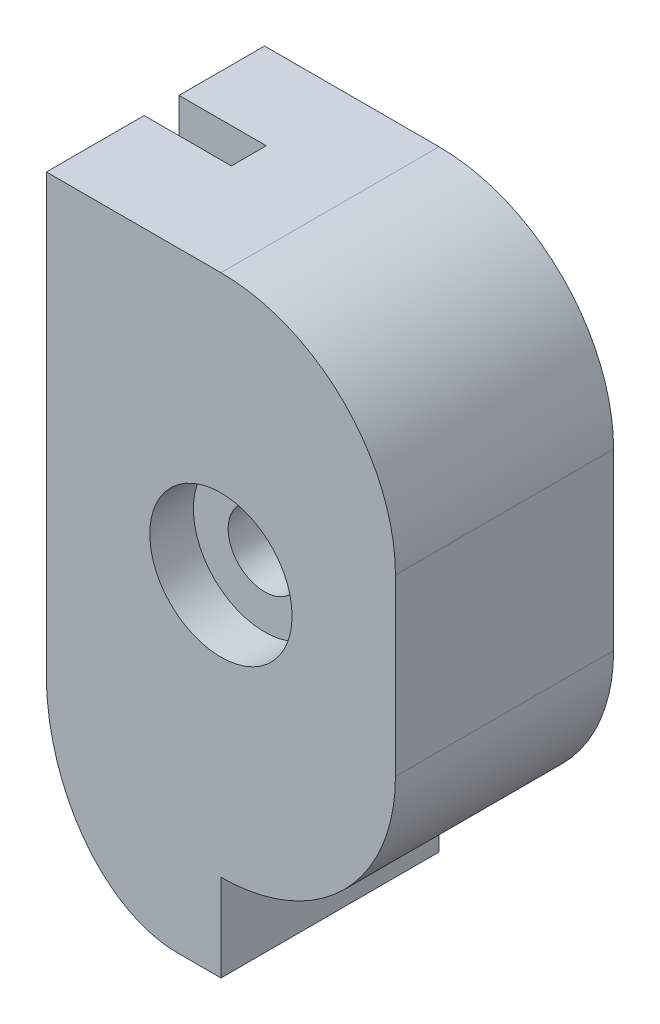
ISO-10303-21;
HEADER;
FILE_DESCRIPTION(('STEP AP214'),'2;1');
FILE_NAME('part.step','',(''),(''),'','','');
FILE_SCHEMA(('AUTOMOTIVE_DESIGN { 1 0 10303 214 1 1 1 1 }'));
ENDSEC;
DATA;
#1=APPLICATION_CONTEXT('core data for automotive mechanical design processes');
#2=APPLICATION_PROTOCOL_DEFINITION('international standard','automotive_design',2000,#1);
#3=PRODUCT_CONTEXT('',#1,'mechanical');
#4=PRODUCT('Part','Part','',(#3));
#5=PRODUCT_RELATED_PRODUCT_CATEGORY('part','',(#4));
#6=PRODUCT_DEFINITION_FORMATION('','',#4);
#7=PRODUCT_DEFINITION_CONTEXT('part definition',#1,'design');
#8=PRODUCT_DEFINITION('design','',#6,#7);
#9=PRODUCT_DEFINITION_SHAPE('','',#8);
#10=(LENGTH_UNIT() NAMED_UNIT(*) SI_UNIT(.MILLI.,.METRE.));
#11=(NAMED_UNIT(*) PLANE_ANGLE_UNIT() SI_UNIT($,.RADIAN.));
#12=(NAMED_UNIT(*) SI_UNIT($,.STERADIAN.) SOLID_ANGLE_UNIT());
#13=UNCERTAINTY_MEASURE_WITH_UNIT(LENGTH_MEASURE(1.E-05),#10,'distance_accuracy_value','');
#14=(GEOMETRIC_REPRESENTATION_CONTEXT(3) GLOBAL_UNCERTAINTY_ASSIGNED_CONTEXT((#13)) GLOBAL_UNIT_ASSIGNED_CONTEXT((#10,
#11,#12)) REPRESENTATION_CONTEXT('',''));
#15=CARTESIAN_POINT('',(0.,0.,0.));
#16=DIRECTION('',(0.,0.,1.));
#17=DIRECTION('',(1.,0.,0.));
#18=AXIS2_PLACEMENT_3D('',#15,#16,#17);
#19=CARTESIAN_POINT('',(-20.,30.,12.5));
#20=DIRECTION('',(1.,0.,0.));
#21=DIRECTION('',(0.,1.,0.));
#22=AXIS2_PLACEMENT_3D('',#19,#20,#21);
#23=PLANE('',#22);
#24=DIRECTION('',(0.,-1.,0.));
#25=VECTOR('',#24,1.);
#26=CARTESIAN_POINT('',(-20.,30.,-12.5));
#27=LINE('',#26,#25);
#28=CARTESIAN_POINT('',(-20.,1.77940468532406,-12.5));
#29=VERTEX_POINT('',#28);
#30=CARTESIAN_POINT('',(-20.,-20.,-12.5));
#31=VERTEX_POINT('',#30);
#32=EDGE_CURVE('E208',#29,#31,#27,.T.);
#33=ORIENTED_EDGE('',*,*,#32,.T.);
#34=CARTESIAN_POINT('',(-20.,-20.,13.75));
#35=CARTESIAN_POINT('',(-20.,-20.,4.58333333333333));
#36=CARTESIAN_POINT('',(-20.,-20.,-4.58333333333333));
#37=CARTESIAN_POINT('',(-20.,-20.,-13.75));
#38=(BOUNDED_CURVE() B_SPLINE_CURVE(3,(#34,#35,#36,#37),.UNSPECIFIED.,.F.,
.F.) B_SPLINE_CURVE_WITH_KNOTS((4,4),(-0.01375,0.01375),
.UNSPECIFIED.) CURVE() GEOMETRIC_REPRESENTATION_ITEM() RATIONAL_B_SPLINE_CURVE((1.,1.,1.,1.)) REPRESENTATION_ITEM(''));
#39=CARTESIAN_POINT('',(-20.,-20.,-2.69593991600876));
#40=VERTEX_POINT('',#39);
#41=EDGE_CURVE('E376',#31,#40,#38,.F.);
#42=ORIENTED_EDGE('',*,*,#41,.T.);
#43=DIRECTION('',(0.,-1.,0.));
#44=VECTOR('',#43,1.);
#45=CARTESIAN_POINT('',(-20.,30.,-2.69593991600876));
#46=LINE('',#45,#44);
#47=CARTESIAN_POINT('',(-20.,30.,-2.69593991600876));
#48=VERTEX_POINT('',#47);
#49=EDGE_CURVE('E324',#48,#40,#46,.T.);
#50=ORIENTED_EDGE('',*,*,#49,.F.);
#51=DIRECTION('',(0.,0.,-1.));
#52=VECTOR('',#51,1.);
#53=CARTESIAN_POINT('',(-20.,30.,12.5));
#54=LINE('',#53,#52);
#55=CARTESIAN_POINT('',(-20.,30.,-12.5));
#56=VERTEX_POINT('',#55);
#57=EDGE_CURVE('E336',#48,#56,#54,.T.);
#58=ORIENTED_EDGE('',*,*,#57,.T.);
#59=CARTESIAN_POINT('',(-20.,3.18411934499227,-12.5));
#60=VERTEX_POINT('',#59);
#61=EDGE_CURVE('E337',#56,#60,#27,.T.);
#62=ORIENTED_EDGE('',*,*,#61,.T.);
#63=DIRECTION('',(0.,0.,-1.));
#64=VECTOR('',#63,1.);
#65=CARTESIAN_POINT('',(-20.,3.18411934499227,-8.5));
#66=LINE('',#65,#64);
#67=CARTESIAN_POINT('',(-20.,3.18411934499227,-8.5));
#68=VERTEX_POINT('',#67);
#69=EDGE_CURVE('E386',#68,#60,#66,.T.);
#70=ORIENTED_EDGE('',*,*,#69,.F.);
#71=DIRECTION('',(0.,-1.,0.));
#72=VECTOR('',#71,1.);
#73=CARTESIAN_POINT('',(-20.,3.18411934499227,-8.5));
#74=LINE('',#73,#72);
#75=CARTESIAN_POINT('',(-20.,1.77940468532406,-8.5));
#76=VERTEX_POINT('',#75);
#77=EDGE_CURVE('E713',#68,#76,#74,.T.);
#78=ORIENTED_EDGE('',*,*,#77,.T.);
#79=DIRECTION('',(0.,0.,-1.));
#80=VECTOR('',#79,1.);
#81=CARTESIAN_POINT('',(-20.,1.77940468532406,-8.5));
#82=LINE('',#81,#80);
#83=EDGE_CURVE('E701',#76,#29,#82,.T.);
#84=ORIENTED_EDGE('',*,*,#83,.T.);
#85=EDGE_LOOP('',(#33,#42,#50,#58,#62,#70,#78,#84));
#86=FACE_BOUND('',#85,.T.);
#87=ADVANCED_FACE('F40',(#86),#23,.F.);
#88=CARTESIAN_POINT('',(0.,0.,-12.5));
#89=DIRECTION('',(0.,0.,1.));
#90=DIRECTION('',(1.,0.,0.));
#91=AXIS2_PLACEMENT_3D('',#88,#89,#90);
#92=PLANE('',#91);
#93=DIRECTION('',(1.,0.,0.));
#94=VECTOR('',#93,1.);
#95=CARTESIAN_POINT('',(-20.,-40.,-12.5));
#96=LINE('',#95,#94);
#97=CARTESIAN_POINT('',(-4.99999999999999,-40.,-12.5));
#98=VERTEX_POINT('',#97);
#99=CARTESIAN_POINT('',(0.,-40.,-12.5));
#100=VERTEX_POINT('',#99);
#101=EDGE_CURVE('E169',#98,#100,#96,.T.);
#102=ORIENTED_EDGE('',*,*,#101,.F.);
#103=CARTESIAN_POINT('',(-20.,-20.,-12.5));
#104=CARTESIAN_POINT('',(-20.,-40.,-12.5));
#105=CARTESIAN_POINT('',(-4.99999999999999,-40.,-12.5));
#106=(BOUNDED_CURVE() B_SPLINE_CURVE(2,(#103,#104,#105),.UNSPECIFIED.,.F.,
.F.) B_SPLINE_CURVE_WITH_KNOTS((3,3),(0.,1.),
.UNSPECIFIED.) CURVE() GEOMETRIC_REPRESENTATION_ITEM() RATIONAL_B_SPLINE_CURVE((1.,
0.707106781186548,1.)) REPRESENTATION_ITEM(''));
#107=EDGE_CURVE('E373',#98,#31,#106,.F.);
#108=ORIENTED_EDGE('',*,*,#107,.T.);
#109=ORIENTED_EDGE('',*,*,#32,.F.);
#110=DIRECTION('',(0.939692620785908,-0.342020143325669,0.));
#111=VECTOR('',#110,1.);
#112=CARTESIAN_POINT('',(0.,-5.5,-12.5));
#113=LINE('',#112,#111);
#114=CARTESIAN_POINT('',(-7.69838959174189,-2.69801533682121,-12.5));
#115=VERTEX_POINT('',#114);
#116=EDGE_CURVE('E687',#29,#115,#113,.T.);
#117=ORIENTED_EDGE('',*,*,#116,.T.);
#118=CARTESIAN_POINT('',(0.,0.,-12.5));
#119=DIRECTION('',(0.,0.,1.));
#120=DIRECTION('',(1.,0.,0.));
#121=AXIS2_PLACEMENT_3D('',#118,#119,#120);
#122=CIRCLE('',#121,8.15748055860155);
#123=CARTESIAN_POINT('',(-8.07513105136094,-1.15617799983766,-12.5));
#124=VERTEX_POINT('',#123);
#125=EDGE_CURVE('E330',#115,#124,#122,.T.);
#126=ORIENTED_EDGE('',*,*,#125,.T.);
#127=DIRECTION('',(-0.939692620785908,0.342020143325669,0.));
#128=VECTOR('',#127,1.);
#129=CARTESIAN_POINT('',(0.,-4.09528534033179,-12.5));
#130=LINE('',#129,#128);
#131=EDGE_CURVE('E188',#124,#60,#130,.T.);
#132=ORIENTED_EDGE('',*,*,#131,.T.);
#133=ORIENTED_EDGE('',*,*,#61,.F.);
#134=DIRECTION('',(1.,0.,0.));
#135=VECTOR('',#134,1.);
#136=CARTESIAN_POINT('',(-20.,30.,-12.5));
#137=LINE('',#136,#135);
#138=CARTESIAN_POINT('',(0.,30.,-12.5));
#139=VERTEX_POINT('',#138);
#140=EDGE_CURVE('E323',#56,#139,#137,.T.);
#141=ORIENTED_EDGE('',*,*,#140,.T.);
#142=CARTESIAN_POINT('',(0.,10.,-12.5));
#143=DIRECTION('',(0.,0.,1.));
#144=DIRECTION('',(1.,0.,0.));
#145=AXIS2_PLACEMENT_3D('',#142,#143,#144);
#146=CIRCLE('',#145,20.);
#147=CARTESIAN_POINT('',(20.,10.,-12.5));
#148=VERTEX_POINT('',#147);
#149=EDGE_CURVE('E360',#139,#148,#146,.F.);
#150=ORIENTED_EDGE('',*,*,#149,.T.);
#151=DIRECTION('',(0.,-1.,0.));
#152=VECTOR('',#151,1.);
#153=CARTESIAN_POINT('',(20.,30.,-12.5));
#154=LINE('',#153,#152);
#155=CARTESIAN_POINT('',(20.,-9.99999999999999,-12.5));
#156=VERTEX_POINT('',#155);
#157=EDGE_CURVE('E341',#148,#156,#154,.T.);
#158=ORIENTED_EDGE('',*,*,#157,.T.);
#159=CARTESIAN_POINT('',(0.,-10.,-12.5));
#160=DIRECTION('',(0.,0.,1.));
#161=DIRECTION('',(1.,0.,0.));
#162=AXIS2_PLACEMENT_3D('',#159,#160,#161);
#163=CIRCLE('',#162,20.);
#164=CARTESIAN_POINT('',(0.,-30.,-12.5));
#165=VERTEX_POINT('',#164);
#166=EDGE_CURVE('E184',#156,#165,#163,.F.);
#167=ORIENTED_EDGE('',*,*,#166,.T.);
#168=DIRECTION('',(0.,1.,0.));
#169=VECTOR('',#168,1.);
#170=CARTESIAN_POINT('',(0.,-40.,-12.5));
#171=LINE('',#170,#169);
#172=EDGE_CURVE('E181',#100,#165,#171,.T.);
#173=ORIENTED_EDGE('',*,*,#172,.F.);
#174=EDGE_LOOP('',(#102,#108,#109,#117,#126,#132,#133,#141,#150,#158,#167,#173));
#175=FACE_BOUND('',#174,.T.);
#176=ADVANCED_FACE('F182',(#175),#92,.F.);
#177=CARTESIAN_POINT('',(0.,0.,19.1694168368741));
#178=DIRECTION('',(0.,0.,1.));
#179=DIRECTION('',(1.,0.,0.));
#180=AXIS2_PLACEMENT_3D('',#177,#178,#179);
#181=CYLINDRICAL_SURFACE('',#180,8.15748055860155);
#182=CARTESIAN_POINT('',(0.,0.,-7.5));
#183=DIRECTION('',(0.,0.,1.));
#184=DIRECTION('',(1.,0.,0.));
#185=AXIS2_PLACEMENT_3D('',#182,#183,#184);
#186=CIRCLE('',#185,8.15748055860155);
#187=CARTESIAN_POINT('',(8.15748055860155,0.,-7.5));
#188=VERTEX_POINT('',#187);
#189=EDGE_CURVE('E668',#188,#188,#186,.T.);
#190=ORIENTED_EDGE('',*,*,#189,.T.);
#191=EDGE_LOOP('',(#190));
#192=FACE_BOUND('',#191,.T.);
#193=DIRECTION('',(0.,0.,1.));
#194=VECTOR('',#193,1.);
#195=CARTESIAN_POINT('',(-8.07513105136094,-1.15617799983766,19.1694168368741));
#196=LINE('',#195,#194);
#197=CARTESIAN_POINT('',(-8.07513105136094,-1.15617799983766,-8.5));
#198=VERTEX_POINT('',#197);
#199=EDGE_CURVE('E352',#124,#198,#196,.T.);
#200=ORIENTED_EDGE('',*,*,#199,.F.);
#201=ORIENTED_EDGE('',*,*,#125,.F.);
#202=DIRECTION('',(0.,0.,1.));
#203=VECTOR('',#202,1.);
#204=CARTESIAN_POINT('',(-7.69838959174189,-2.69801533682121,19.1694168368741));
#205=LINE('',#204,#203);
#206=CARTESIAN_POINT('',(-7.69838959174189,-2.69801533682121,-8.5));
#207=VERTEX_POINT('',#206);
#208=EDGE_CURVE('E350',#207,#115,#205,.F.);
#209=ORIENTED_EDGE('',*,*,#208,.F.);
#210=CARTESIAN_POINT('',(0.,0.,-8.5));
#211=DIRECTION('',(0.,0.,-1.));
#212=DIRECTION('',(-1.,0.,0.));
#213=AXIS2_PLACEMENT_3D('',#210,#211,#212);
#214=CIRCLE('',#213,8.15748055860155);
#215=EDGE_CURVE('E348',#198,#207,#214,.F.);
#216=ORIENTED_EDGE('',*,*,#215,.F.);
#217=EDGE_LOOP('',(#200,#201,#209,#216));
#218=FACE_BOUND('',#217,.T.);
#219=ADVANCED_FACE('F301',(#192,#218),#181,.F.);
#220=DIRECTION('',(0.,1.,0.));
#221=VECTOR('',#220,1.);
#222=CARTESIAN_POINT('',(-20.,30.,1.30406008399123));
#223=LINE('',#222,#221);
#224=CARTESIAN_POINT('',(-20.,-20.,1.30406008399124));
#225=VERTEX_POINT('',#224);
#226=CARTESIAN_POINT('',(-20.,30.,1.30406008399123));
#227=VERTEX_POINT('',#226);
#228=EDGE_CURVE('E385',#225,#227,#223,.T.);
#229=ORIENTED_EDGE('',*,*,#228,.F.);
#230=CARTESIAN_POINT('',(-20.,-20.,13.75));
#231=CARTESIAN_POINT('',(-20.,-20.,4.58333333333333));
#232=CARTESIAN_POINT('',(-20.,-20.,-4.58333333333333));
#233=CARTESIAN_POINT('',(-20.,-20.,-13.75));
#234=(BOUNDED_CURVE() B_SPLINE_CURVE(3,(#230,#231,#232,#233),.UNSPECIFIED.,.F.,
.F.) B_SPLINE_CURVE_WITH_KNOTS((4,4),(-0.01375,0.01375),
.UNSPECIFIED.) CURVE() GEOMETRIC_REPRESENTATION_ITEM() RATIONAL_B_SPLINE_CURVE((1.,1.,1.,1.)) REPRESENTATION_ITEM(''));
#235=CARTESIAN_POINT('',(-20.,-20.,12.5));
#236=VERTEX_POINT('',#235);
#237=EDGE_CURVE('E317',#225,#236,#234,.F.);
#238=ORIENTED_EDGE('',*,*,#237,.T.);
#239=DIRECTION('',(0.,-1.,0.));
#240=VECTOR('',#239,1.);
#241=CARTESIAN_POINT('',(-20.,30.,12.5));
#242=LINE('',#241,#240);
#243=CARTESIAN_POINT('',(-20.,30.,12.5));
#244=VERTEX_POINT('',#243);
#245=EDGE_CURVE('E319',#244,#236,#242,.T.);
#246=ORIENTED_EDGE('',*,*,#245,.F.);
#247=EDGE_CURVE('E345',#244,#227,#54,.T.);
#248=ORIENTED_EDGE('',*,*,#247,.T.);
#249=EDGE_LOOP('',(#229,#238,#246,#248));
#250=FACE_BOUND('',#249,.T.);
#251=ADVANCED_FACE('F290',(#250),#23,.F.);
#252=CARTESIAN_POINT('',(20.,30.,12.5));
#253=DIRECTION('',(1.,0.,0.));
#254=DIRECTION('',(0.,1.,0.));
#255=AXIS2_PLACEMENT_3D('',#252,#253,#254);
#256=PLANE('',#255);
#257=DIRECTION('',(0.,-1.,0.));
#258=VECTOR('',#257,1.);
#259=CARTESIAN_POINT('',(20.,30.,12.5));
#260=LINE('',#259,#258);
#261=CARTESIAN_POINT('',(20.,10.,12.5));
#262=VERTEX_POINT('',#261);
#263=CARTESIAN_POINT('',(20.,-9.99999999999999,12.5));
#264=VERTEX_POINT('',#263);
#265=EDGE_CURVE('E322',#262,#264,#260,.T.);
#266=ORIENTED_EDGE('',*,*,#265,.T.);
#267=DIRECTION('',(0.,0.,-1.));
#268=VECTOR('',#267,1.);
#269=CARTESIAN_POINT('',(20.,-9.99999999999999,-12.5));
#270=LINE('',#269,#268);
#271=EDGE_CURVE('E357',#264,#156,#270,.T.);
#272=ORIENTED_EDGE('',*,*,#271,.T.);
#273=ORIENTED_EDGE('',*,*,#157,.F.);
#274=DIRECTION('',(0.,0.,-1.));
#275=VECTOR('',#274,1.);
#276=CARTESIAN_POINT('',(20.,10.,12.5));
#277=LINE('',#276,#275);
#278=EDGE_CURVE('E355',#148,#262,#277,.F.);
#279=ORIENTED_EDGE('',*,*,#278,.T.);
#280=EDGE_LOOP('',(#266,#272,#273,#279));
#281=FACE_BOUND('',#280,.T.);
#282=ADVANCED_FACE('F300',(#281),#256,.T.);
#283=CARTESIAN_POINT('',(-20.,30.,12.5));
#284=DIRECTION('',(0.,1.,0.));
#285=DIRECTION('',(0.,0.,1.));
#286=AXIS2_PLACEMENT_3D('',#283,#284,#285);
#287=PLANE('',#286);
#288=DIRECTION('',(1.,0.,0.));
#289=VECTOR('',#288,1.);
#290=CARTESIAN_POINT('',(-20.,30.,12.5));
#291=LINE('',#290,#289);
#292=CARTESIAN_POINT('',(0.,30.,12.5));
#293=VERTEX_POINT('',#292);
#294=EDGE_CURVE('E334',#244,#293,#291,.T.);
#295=ORIENTED_EDGE('',*,*,#294,.T.);
#296=DIRECTION('',(0.,0.,-1.));
#297=VECTOR('',#296,1.);
#298=CARTESIAN_POINT('',(0.,30.,12.5));
#299=LINE('',#298,#297);
#300=EDGE_CURVE('E368',#293,#139,#299,.T.);
#301=ORIENTED_EDGE('',*,*,#300,.T.);
#302=ORIENTED_EDGE('',*,*,#140,.F.);
#303=ORIENTED_EDGE('',*,*,#57,.F.);
#304=DIRECTION('',(-1.,0.,0.));
#305=VECTOR('',#304,1.);
#306=CARTESIAN_POINT('',(-10.,30.,-2.69593991600876));
#307=LINE('',#306,#305);
#308=CARTESIAN_POINT('',(-10.,30.,-2.69593991600876));
#309=VERTEX_POINT('',#308);
#310=EDGE_CURVE('E384',#309,#48,#307,.T.);
#311=ORIENTED_EDGE('',*,*,#310,.F.);
#312=DIRECTION('',(0.,0.,-1.));
#313=VECTOR('',#312,1.);
#314=CARTESIAN_POINT('',(-10.,30.,-2.69593991600876));
#315=LINE('',#314,#313);
#316=CARTESIAN_POINT('',(-10.,30.,1.30406008399124));
#317=VERTEX_POINT('',#316);
#318=EDGE_CURVE('E284',#317,#309,#315,.T.);
#319=ORIENTED_EDGE('',*,*,#318,.F.);
#320=DIRECTION('',(-1.,0.,0.));
#321=VECTOR('',#320,1.);
#322=CARTESIAN_POINT('',(-10.,30.,1.30406008399123));
#323=LINE('',#322,#321);
#324=EDGE_CURVE('E273',#317,#227,#323,.T.);
#325=ORIENTED_EDGE('',*,*,#324,.T.);
#326=ORIENTED_EDGE('',*,*,#247,.F.);
#327=EDGE_LOOP('',(#295,#301,#302,#303,#311,#319,#325,#326));
#328=FACE_BOUND('',#327,.T.);
#329=ADVANCED_FACE('F465',(#328),#287,.T.);
#330=CARTESIAN_POINT('',(0.,0.,12.5));
#331=DIRECTION('',(0.,0.,1.));
#332=DIRECTION('',(1.,0.,0.));
#333=AXIS2_PLACEMENT_3D('',#330,#331,#332);
#334=PLANE('',#333);
#335=CARTESIAN_POINT('',(0.,0.,12.5));
#336=DIRECTION('',(0.,0.,1.));
#337=DIRECTION('',(1.,0.,0.));
#338=AXIS2_PLACEMENT_3D('',#335,#336,#337);
#339=CIRCLE('',#338,8.15748055860155);
#340=CARTESIAN_POINT('',(8.15748055860155,0.,12.5));
#341=VERTEX_POINT('',#340);
#342=EDGE_CURVE('E281',#341,#341,#339,.T.);
#343=ORIENTED_EDGE('',*,*,#342,.F.);
#344=EDGE_LOOP('',(#343));
#345=FACE_BOUND('',#344,.T.);
#346=ORIENTED_EDGE('',*,*,#245,.T.);
#347=CARTESIAN_POINT('',(-4.99999999999999,-40.,12.5));
#348=CARTESIAN_POINT('',(-20.,-40.,12.5));
#349=CARTESIAN_POINT('',(-20.,-20.,12.5));
#350=(BOUNDED_CURVE() B_SPLINE_CURVE(2,(#347,#348,#349),.UNSPECIFIED.,.F.,
.F.) B_SPLINE_CURVE_WITH_KNOTS((3,3),(0.,1.),
.UNSPECIFIED.) CURVE() GEOMETRIC_REPRESENTATION_ITEM() RATIONAL_B_SPLINE_CURVE((1.,
0.707106781186548,1.)) REPRESENTATION_ITEM(''));
#351=CARTESIAN_POINT('',(-4.99999999999999,-40.,12.5));
#352=VERTEX_POINT('',#351);
#353=EDGE_CURVE('E12',#236,#352,#350,.F.);
#354=ORIENTED_EDGE('',*,*,#353,.T.);
#355=DIRECTION('',(1.,0.,0.));
#356=VECTOR('',#355,1.);
#357=CARTESIAN_POINT('',(-20.,-40.,12.5));
#358=LINE('',#357,#356);
#359=CARTESIAN_POINT('',(0.,-40.,12.5));
#360=VERTEX_POINT('',#359);
#361=EDGE_CURVE('E194',#352,#360,#358,.T.);
#362=ORIENTED_EDGE('',*,*,#361,.T.);
#363=DIRECTION('',(0.,1.,0.));
#364=VECTOR('',#363,1.);
#365=CARTESIAN_POINT('',(0.,-40.,12.5));
#366=LINE('',#365,#364);
#367=CARTESIAN_POINT('',(0.,-30.,12.5));
#368=VERTEX_POINT('',#367);
#369=EDGE_CURVE('E189',#360,#368,#366,.T.);
#370=ORIENTED_EDGE('',*,*,#369,.T.);
#371=CARTESIAN_POINT('',(0.,-10.,12.5));
#372=DIRECTION('',(0.,0.,1.));
#373=DIRECTION('',(1.,0.,0.));
#374=AXIS2_PLACEMENT_3D('',#371,#372,#373);
#375=CIRCLE('',#374,20.);
#376=EDGE_CURVE('E367',#368,#264,#375,.T.);
#377=ORIENTED_EDGE('',*,*,#376,.T.);
#378=ORIENTED_EDGE('',*,*,#265,.F.);
#379=CARTESIAN_POINT('',(0.,10.,12.5));
#380=DIRECTION('',(0.,0.,1.));
#381=DIRECTION('',(1.,0.,0.));
#382=AXIS2_PLACEMENT_3D('',#379,#380,#381);
#383=CIRCLE('',#382,20.);
#384=EDGE_CURVE('E365',#262,#293,#383,.T.);
#385=ORIENTED_EDGE('',*,*,#384,.T.);
#386=ORIENTED_EDGE('',*,*,#294,.F.);
#387=EDGE_LOOP('',(#346,#354,#362,#370,#377,#378,#385,#386));
#388=FACE_BOUND('',#387,.T.);
#389=ADVANCED_FACE('F454',(#345,#388),#334,.T.);
#390=CARTESIAN_POINT('',(0.,-4.16978401932688,-7.5));
#391=DIRECTION('',(0.,0.,1.));
#392=DIRECTION('',(1.,0.,0.));
#393=AXIS2_PLACEMENT_3D('',#390,#391,#392);
#394=PLANE('',#393);
#395=ORIENTED_EDGE('',*,*,#189,.F.);
#396=EDGE_LOOP('',(#395));
#397=FACE_BOUND('',#396,.T.);
#398=CARTESIAN_POINT('',(0.,0.,-7.5));
#399=DIRECTION('',(0.,0.,1.));
#400=DIRECTION('',(1.,0.,0.));
#401=AXIS2_PLACEMENT_3D('',#398,#399,#400);
#402=CIRCLE('',#401,4.16978401932688);
#403=CARTESIAN_POINT('',(4.16978401932688,0.,-7.5));
#404=VERTEX_POINT('',#403);
#405=EDGE_CURVE('E671',#404,#404,#402,.T.);
#406=ORIENTED_EDGE('',*,*,#405,.T.);
#407=EDGE_LOOP('',(#406));
#408=FACE_BOUND('',#407,.T.);
#409=ADVANCED_FACE('F464',(#397,#408),#394,.F.);
#410=CARTESIAN_POINT('',(0.,0.,19.1694168368741));
#411=DIRECTION('',(0.,0.,1.));
#412=DIRECTION('',(1.,0.,0.));
#413=AXIS2_PLACEMENT_3D('',#410,#411,#412);
#414=CYLINDRICAL_SURFACE('',#413,4.16978401932688);
#415=ORIENTED_EDGE('',*,*,#405,.F.);
#416=EDGE_LOOP('',(#415));
#417=FACE_BOUND('',#416,.T.);
#418=CARTESIAN_POINT('',(0.,0.,7.5));
#419=DIRECTION('',(0.,0.,1.));
#420=DIRECTION('',(1.,0.,0.));
#421=AXIS2_PLACEMENT_3D('',#418,#419,#420);
#422=CIRCLE('',#421,4.16978401932688);
#423=CARTESIAN_POINT('',(4.16978401932688,0.,7.5));
#424=VERTEX_POINT('',#423);
#425=EDGE_CURVE('E672',#424,#424,#422,.T.);
#426=ORIENTED_EDGE('',*,*,#425,.T.);
#427=EDGE_LOOP('',(#426));
#428=FACE_BOUND('',#427,.T.);
#429=ADVANCED_FACE('F636',(#417,#428),#414,.F.);
#430=CARTESIAN_POINT('',(0.,-8.15748055860155,7.5));
#431=DIRECTION('',(0.,0.,-1.));
#432=DIRECTION('',(-1.,0.,0.));
#433=AXIS2_PLACEMENT_3D('',#430,#431,#432);
#434=PLANE('',#433);
#435=ORIENTED_EDGE('',*,*,#425,.F.);
#436=EDGE_LOOP('',(#435));
#437=FACE_BOUND('',#436,.T.);
#438=CARTESIAN_POINT('',(0.,0.,7.5));
#439=DIRECTION('',(0.,0.,1.));
#440=DIRECTION('',(1.,0.,0.));
#441=AXIS2_PLACEMENT_3D('',#438,#439,#440);
#442=CIRCLE('',#441,8.15748055860155);
#443=CARTESIAN_POINT('',(8.15748055860155,0.,7.5));
#444=VERTEX_POINT('',#443);
#445=EDGE_CURVE('E484',#444,#444,#442,.T.);
#446=ORIENTED_EDGE('',*,*,#445,.T.);
#447=EDGE_LOOP('',(#446));
#448=FACE_BOUND('',#447,.T.);
#449=ADVANCED_FACE('F625',(#437,#448),#434,.F.);
#450=CARTESIAN_POINT('',(0.,0.,19.1694168368741));
#451=DIRECTION('',(0.,0.,1.));
#452=DIRECTION('',(1.,0.,0.));
#453=AXIS2_PLACEMENT_3D('',#450,#451,#452);
#454=CYLINDRICAL_SURFACE('',#453,8.15748055860155);
#455=ORIENTED_EDGE('',*,*,#445,.F.);
#456=EDGE_LOOP('',(#455));
#457=FACE_BOUND('',#456,.T.);
#458=ORIENTED_EDGE('',*,*,#342,.T.);
#459=EDGE_LOOP('',(#458));
#460=FACE_BOUND('',#459,.T.);
#461=ADVANCED_FACE('F260',(#457,#460),#454,.F.);
#462=CARTESIAN_POINT('',(-10.,30.,-2.69593991600876));
#463=DIRECTION('',(0.,0.,-1.));
#464=DIRECTION('',(-1.,0.,0.));
#465=AXIS2_PLACEMENT_3D('',#462,#463,#464);
#466=PLANE('',#465);
#467=ORIENTED_EDGE('',*,*,#49,.T.);
#468=CARTESIAN_POINT('',(-4.99999999999999,-40.,-2.69593991600877));
#469=CARTESIAN_POINT('',(-20.,-40.,-2.69593991600877));
#470=CARTESIAN_POINT('',(-20.,-20.,-2.69593991600877));
#471=(BOUNDED_CURVE() B_SPLINE_CURVE(2,(#468,#469,#470),.UNSPECIFIED.,.F.,
.F.) B_SPLINE_CURVE_WITH_KNOTS((3,3),(0.,1.),
.UNSPECIFIED.) CURVE() GEOMETRIC_REPRESENTATION_ITEM() RATIONAL_B_SPLINE_CURVE((1.,
0.707106781186548,1.)) REPRESENTATION_ITEM(''));
#472=CARTESIAN_POINT('',(-17.9903810567666,-30.,-2.69593991600876));
#473=VERTEX_POINT('',#472);
#474=EDGE_CURVE('E70',#40,#473,#471,.F.);
#475=ORIENTED_EDGE('',*,*,#474,.T.);
#476=DIRECTION('',(-1.,0.,0.));
#477=VECTOR('',#476,1.);
#478=CARTESIAN_POINT('',(-9.99999999999999,-30.,-2.69593991600876));
#479=LINE('',#478,#477);
#480=CARTESIAN_POINT('',(-9.99999999999999,-30.,-2.69593991600876));
#481=VERTEX_POINT('',#480);
#482=EDGE_CURVE('E274',#481,#473,#479,.T.);
#483=ORIENTED_EDGE('',*,*,#482,.F.);
#484=DIRECTION('',(0.,-1.,0.));
#485=VECTOR('',#484,1.);
#486=CARTESIAN_POINT('',(-10.,30.,-2.69593991600876));
#487=LINE('',#486,#485);
#488=EDGE_CURVE('E479',#309,#481,#487,.T.);
#489=ORIENTED_EDGE('',*,*,#488,.F.);
#490=ORIENTED_EDGE('',*,*,#310,.T.);
#491=EDGE_LOOP('',(#467,#475,#483,#489,#490));
#492=FACE_BOUND('',#491,.T.);
#493=ADVANCED_FACE('F255',(#492),#466,.F.);
#494=CARTESIAN_POINT('',(-10.,30.,1.30406008399123));
#495=DIRECTION('',(0.,0.,1.));
#496=DIRECTION('',(0.,-1.,0.));
#497=AXIS2_PLACEMENT_3D('',#494,#495,#496);
#498=PLANE('',#497);
#499=DIRECTION('',(-1.,0.,0.));
#500=VECTOR('',#499,1.);
#501=CARTESIAN_POINT('',(-9.99999999999999,-30.,1.30406008399124));
#502=LINE('',#501,#500);
#503=CARTESIAN_POINT('',(-9.99999999999999,-30.,1.30406008399124));
#504=VERTEX_POINT('',#503);
#505=CARTESIAN_POINT('',(-17.9903810567666,-30.,1.30406008399124));
#506=VERTEX_POINT('',#505);
#507=EDGE_CURVE('E266',#504,#506,#502,.T.);
#508=ORIENTED_EDGE('',*,*,#507,.T.);
#509=CARTESIAN_POINT('',(-20.,-20.,1.30406008399124));
#510=CARTESIAN_POINT('',(-20.,-40.,1.30406008399124));
#511=CARTESIAN_POINT('',(-4.99999999999999,-40.,1.30406008399124));
#512=(BOUNDED_CURVE() B_SPLINE_CURVE(2,(#509,#510,#511),.UNSPECIFIED.,.F.,
.F.) B_SPLINE_CURVE_WITH_KNOTS((3,3),(0.,1.),
.UNSPECIFIED.) CURVE() GEOMETRIC_REPRESENTATION_ITEM() RATIONAL_B_SPLINE_CURVE((1.,
0.707106781186548,1.)) REPRESENTATION_ITEM(''));
#513=EDGE_CURVE('E54',#506,#225,#512,.F.);
#514=ORIENTED_EDGE('',*,*,#513,.T.);
#515=ORIENTED_EDGE('',*,*,#228,.T.);
#516=ORIENTED_EDGE('',*,*,#324,.F.);
#517=DIRECTION('',(0.,1.,0.));
#518=VECTOR('',#517,1.);
#519=CARTESIAN_POINT('',(-10.,30.,1.30406008399123));
#520=LINE('',#519,#518);
#521=EDGE_CURVE('E709',#504,#317,#520,.T.);
#522=ORIENTED_EDGE('',*,*,#521,.F.);
#523=EDGE_LOOP('',(#508,#514,#515,#516,#522));
#524=FACE_BOUND('',#523,.T.);
#525=ADVANCED_FACE('F244',(#524),#498,.F.);
#526=CARTESIAN_POINT('',(-9.99999999999999,0.,0.));
#527=DIRECTION('',(-1.,0.,0.));
#528=DIRECTION('',(0.,-1.,0.));
#529=AXIS2_PLACEMENT_3D('',#526,#527,#528);
#530=PLANE('',#529);
#531=ORIENTED_EDGE('',*,*,#488,.T.);
#532=DIRECTION('',(0.,0.,1.));
#533=VECTOR('',#532,1.);
#534=CARTESIAN_POINT('',(-9.99999999999999,-30.,-2.69593991600876));
#535=LINE('',#534,#533);
#536=EDGE_CURVE('E706',#481,#504,#535,.T.);
#537=ORIENTED_EDGE('',*,*,#536,.T.);
#538=ORIENTED_EDGE('',*,*,#521,.T.);
#539=ORIENTED_EDGE('',*,*,#318,.T.);
#540=EDGE_LOOP('',(#531,#537,#538,#539));
#541=FACE_BOUND('',#540,.T.);
#542=ADVANCED_FACE('F254',(#541),#530,.T.);
#543=CARTESIAN_POINT('',(0.,-4.09528534033179,-8.5));
#544=DIRECTION('',(-0.342020143325669,-0.939692620785908,0.));
#545=DIRECTION('',(0.939692620785908,-0.342020143325669,0.));
#546=AXIS2_PLACEMENT_3D('',#543,#544,#545);
#547=PLANE('',#546);
#548=ORIENTED_EDGE('',*,*,#199,.T.);
#549=DIRECTION('',(-0.939692620785908,0.342020143325669,0.));
#550=VECTOR('',#549,1.);
#551=CARTESIAN_POINT('',(0.,-4.09528534033179,-8.5));
#552=LINE('',#551,#550);
#553=EDGE_CURVE('E692',#198,#68,#552,.T.);
#554=ORIENTED_EDGE('',*,*,#553,.T.);
#555=ORIENTED_EDGE('',*,*,#69,.T.);
#556=ORIENTED_EDGE('',*,*,#131,.F.);
#557=EDGE_LOOP('',(#548,#554,#555,#556));
#558=FACE_BOUND('',#557,.T.);
#559=ADVANCED_FACE('F599',(#558),#547,.T.);
#560=CARTESIAN_POINT('',(0.,-5.5,-8.5));
#561=DIRECTION('',(0.342020143325669,0.939692620785908,0.));
#562=DIRECTION('',(-0.939692620785908,0.342020143325669,0.));
#563=AXIS2_PLACEMENT_3D('',#560,#561,#562);
#564=PLANE('',#563);
#565=ORIENTED_EDGE('',*,*,#208,.T.);
#566=ORIENTED_EDGE('',*,*,#116,.F.);
#567=ORIENTED_EDGE('',*,*,#83,.F.);
#568=DIRECTION('',(0.939692620785908,-0.342020143325669,0.));
#569=VECTOR('',#568,1.);
#570=CARTESIAN_POINT('',(0.,-5.5,-8.5));
#571=LINE('',#570,#569);
#572=EDGE_CURVE('E698',#76,#207,#571,.T.);
#573=ORIENTED_EDGE('',*,*,#572,.T.);
#574=EDGE_LOOP('',(#565,#566,#567,#573));
#575=FACE_BOUND('',#574,.T.);
#576=ADVANCED_FACE('F508',(#575),#564,.T.);
#577=CARTESIAN_POINT('',(0.,0.,-8.5));
#578=DIRECTION('',(0.,0.,-1.));
#579=DIRECTION('',(-1.,0.,0.));
#580=AXIS2_PLACEMENT_3D('',#577,#578,#579);
#581=PLANE('',#580);
#582=ORIENTED_EDGE('',*,*,#215,.T.);
#583=ORIENTED_EDGE('',*,*,#572,.F.);
#584=ORIENTED_EDGE('',*,*,#77,.F.);
#585=ORIENTED_EDGE('',*,*,#553,.F.);
#586=EDGE_LOOP('',(#582,#583,#584,#585));
#587=FACE_BOUND('',#586,.T.);
#588=ADVANCED_FACE('F501',(#587),#581,.T.);
#589=CARTESIAN_POINT('',(0.,-10.,12.5));
#590=DIRECTION('',(0.,0.,1.));
#591=DIRECTION('',(1.,0.,0.));
#592=AXIS2_PLACEMENT_3D('',#589,#590,#591);
#593=CYLINDRICAL_SURFACE('',#592,20.);
#594=ORIENTED_EDGE('',*,*,#376,.F.);
#595=DIRECTION('',(0.,0.,-1.));
#596=VECTOR('',#595,1.);
#597=CARTESIAN_POINT('',(0.,-30.,12.5));
#598=LINE('',#597,#596);
#599=EDGE_CURVE('E363',#165,#368,#598,.F.);
#600=ORIENTED_EDGE('',*,*,#599,.F.);
#601=ORIENTED_EDGE('',*,*,#166,.F.);
#602=ORIENTED_EDGE('',*,*,#271,.F.);
#603=EDGE_LOOP('',(#594,#600,#601,#602));
#604=FACE_BOUND('',#603,.T.);
#605=ADVANCED_FACE('F304',(#604),#593,.T.);
#606=CARTESIAN_POINT('',(0.,10.,12.5));
#607=DIRECTION('',(0.,0.,-1.));
#608=DIRECTION('',(-1.,0.,0.));
#609=AXIS2_PLACEMENT_3D('',#606,#607,#608);
#610=CYLINDRICAL_SURFACE('',#609,20.);
#611=ORIENTED_EDGE('',*,*,#384,.F.);
#612=ORIENTED_EDGE('',*,*,#278,.F.);
#613=ORIENTED_EDGE('',*,*,#149,.F.);
#614=ORIENTED_EDGE('',*,*,#300,.F.);
#615=EDGE_LOOP('',(#611,#612,#613,#614));
#616=FACE_BOUND('',#615,.T.);
#617=ADVANCED_FACE('F223',(#616),#610,.T.);
#618=CARTESIAN_POINT('',(0.,-30.,0.));
#619=DIRECTION('',(0.,-1.,0.));
#620=DIRECTION('',(0.,0.,-1.));
#621=AXIS2_PLACEMENT_3D('',#618,#619,#620);
#622=PLANE('',#621);
#623=ORIENTED_EDGE('',*,*,#482,.T.);
#624=CARTESIAN_POINT('',(-17.9903810567666,-30.,13.75));
#625=CARTESIAN_POINT('',(-17.9903810567666,-30.,4.58333333333333));
#626=CARTESIAN_POINT('',(-17.9903810567666,-30.,-4.58333333333333));
#627=CARTESIAN_POINT('',(-17.9903810567666,-30.,-13.75));
#628=(BOUNDED_CURVE() B_SPLINE_CURVE(3,(#624,#625,#626,#627),.UNSPECIFIED.,.F.,
.F.) B_SPLINE_CURVE_WITH_KNOTS((4,4),(-0.01375,0.01375),
.UNSPECIFIED.) CURVE() GEOMETRIC_REPRESENTATION_ITEM() RATIONAL_B_SPLINE_CURVE((0.868347502412604,
0.868347502412604,0.868347502412604,0.868347502412604)) REPRESENTATION_ITEM(''));
#629=EDGE_CURVE('E61',#473,#506,#628,.F.);
#630=ORIENTED_EDGE('',*,*,#629,.T.);
#631=ORIENTED_EDGE('',*,*,#507,.F.);
#632=ORIENTED_EDGE('',*,*,#536,.F.);
#633=EDGE_LOOP('',(#623,#630,#631,#632));
#634=FACE_BOUND('',#633,.T.);
#635=ADVANCED_FACE('F219',(#634),#622,.F.);
#636=CARTESIAN_POINT('',(0.,-40.,12.5));
#637=DIRECTION('',(1.,0.,0.));
#638=DIRECTION('',(0.,0.,-1.));
#639=AXIS2_PLACEMENT_3D('',#636,#637,#638);
#640=PLANE('',#639);
#641=ORIENTED_EDGE('',*,*,#599,.T.);
#642=ORIENTED_EDGE('',*,*,#369,.F.);
#643=DIRECTION('',(0.,0.,-1.));
#644=VECTOR('',#643,1.);
#645=CARTESIAN_POINT('',(0.,-40.,12.5));
#646=LINE('',#645,#644);
#647=EDGE_CURVE('E174',#360,#100,#646,.T.);
#648=ORIENTED_EDGE('',*,*,#647,.T.);
#649=ORIENTED_EDGE('',*,*,#172,.T.);
#650=EDGE_LOOP('',(#641,#642,#648,#649));
#651=FACE_BOUND('',#650,.T.);
#652=ADVANCED_FACE('F192',(#651),#640,.T.);
#653=CARTESIAN_POINT('',(0.,-40.,0.));
#654=DIRECTION('',(0.,-1.,0.));
#655=DIRECTION('',(0.,0.,-1.));
#656=AXIS2_PLACEMENT_3D('',#653,#654,#655);
#657=PLANE('',#656);
#658=ORIENTED_EDGE('',*,*,#361,.F.);
#659=CARTESIAN_POINT('',(-4.99999999999999,-40.,-13.75));
#660=CARTESIAN_POINT('',(-4.99999999999999,-40.,-4.58333333333333));
#661=CARTESIAN_POINT('',(-4.99999999999999,-40.,4.58333333333333));
#662=CARTESIAN_POINT('',(-4.99999999999999,-40.,13.75));
#663=(BOUNDED_CURVE() B_SPLINE_CURVE(3,(#659,#660,#661,#662),.UNSPECIFIED.,.F.,
.F.) B_SPLINE_CURVE_WITH_KNOTS((4,4),(-0.01375,0.01375),
.UNSPECIFIED.) CURVE() GEOMETRIC_REPRESENTATION_ITEM() RATIONAL_B_SPLINE_CURVE((1.,1.,1.,1.)) REPRESENTATION_ITEM(''));
#664=EDGE_CURVE('E176',#352,#98,#663,.F.);
#665=ORIENTED_EDGE('',*,*,#664,.T.);
#666=ORIENTED_EDGE('',*,*,#101,.T.);
#667=ORIENTED_EDGE('',*,*,#647,.F.);
#668=EDGE_LOOP('',(#658,#665,#666,#667));
#669=FACE_BOUND('',#668,.T.);
#670=ADVANCED_FACE('F172',(#669),#657,.T.);
#671=CARTESIAN_POINT('',(-20.,-20.,-13.75));
#672=CARTESIAN_POINT('',(-20.,-20.,-4.58333333333333));
#673=CARTESIAN_POINT('',(-20.,-20.,4.58333333333333));
#674=CARTESIAN_POINT('',(-20.,-20.,13.75));
#675=CARTESIAN_POINT('',(-20.,-40.,-13.75));
#676=CARTESIAN_POINT('',(-20.,-40.,-4.58333333333333));
#677=CARTESIAN_POINT('',(-20.,-40.,4.58333333333333));
#678=CARTESIAN_POINT('',(-20.,-40.,13.75));
#679=CARTESIAN_POINT('',(-4.99999999999999,-40.,-13.75));
#680=CARTESIAN_POINT('',(-4.99999999999999,-40.,-4.58333333333333));
#681=CARTESIAN_POINT('',(-4.99999999999999,-40.,4.58333333333333));
#682=CARTESIAN_POINT('',(-4.99999999999999,-40.,13.75));
#683=(BOUNDED_SURFACE() B_SPLINE_SURFACE(2,3,((#671,#672,#673,#674),(#675,#676,#677,#678),(#679,
#680,#681,#682)),.UNSPECIFIED.,.F.,.F.,.F.) B_SPLINE_SURFACE_WITH_KNOTS((3,3),(4,4),(0.,1.),
(-0.01375,0.01375),
.UNSPECIFIED.) GEOMETRIC_REPRESENTATION_ITEM() RATIONAL_B_SPLINE_SURFACE(((1.,1.,1.,1.),
(0.707106781186548,0.707106781186548,0.707106781186548,0.707106781186548),(1.,1.,1.,1.))) REPRESENTATION_ITEM('') SURFACE());
#684=ORIENTED_EDGE('',*,*,#474,.F.);
#685=ORIENTED_EDGE('',*,*,#41,.F.);
#686=ORIENTED_EDGE('',*,*,#107,.F.);
#687=ORIENTED_EDGE('',*,*,#664,.F.);
#688=ORIENTED_EDGE('',*,*,#353,.F.);
#689=ORIENTED_EDGE('',*,*,#237,.F.);
#690=ORIENTED_EDGE('',*,*,#513,.F.);
#691=ORIENTED_EDGE('',*,*,#629,.F.);
#692=EDGE_LOOP('',(#684,#685,#686,#687,#688,#689,#690,#691));
#693=FACE_BOUND('',#692,.T.);
#694=ADVANCED_FACE('F43',(#693),#683,.T.);
#695=CLOSED_SHELL('',(#87,#176,#219,#251,#282,#329,#389,#409,#429,#449,#461,#493,#525,#542,#559,
#576,#588,#605,#617,#635,#652,#670,#694));
#696=MANIFOLD_SOLID_BREP('B2',#695);
#697=ADVANCED_BREP_SHAPE_REPRESENTATION('',(#18,#696),#14);
#698=SHAPE_DEFINITION_REPRESENTATION(#9,#697);
ENDSEC;
END-ISO-10303-21;
